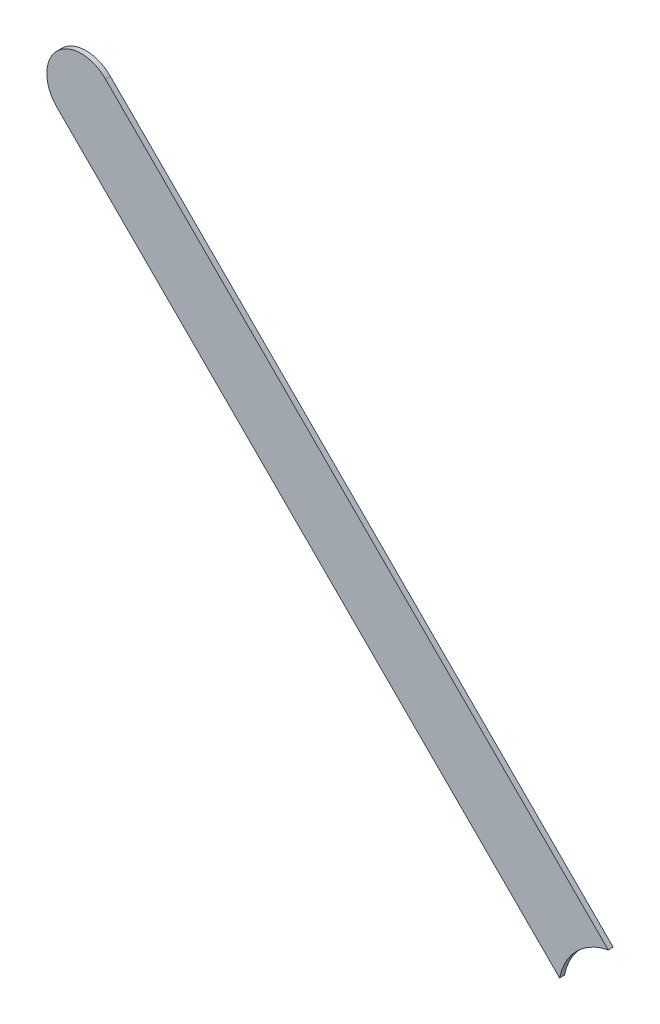
ISO-10303-21;
HEADER;
FILE_DESCRIPTION(('STEP AP214'),'2;1');
FILE_NAME('part.step','',(''),(''),'','','');
FILE_SCHEMA(('AUTOMOTIVE_DESIGN { 1 0 10303 214 1 1 1 1 }'));
ENDSEC;
DATA;
#1=APPLICATION_CONTEXT('core data for automotive mechanical design processes');
#2=APPLICATION_PROTOCOL_DEFINITION('international standard','automotive_design',2000,#1);
#3=PRODUCT_CONTEXT('',#1,'mechanical');
#4=PRODUCT('Part','Part','',(#3));
#5=PRODUCT_RELATED_PRODUCT_CATEGORY('part','',(#4));
#6=PRODUCT_DEFINITION_FORMATION('','',#4);
#7=PRODUCT_DEFINITION_CONTEXT('part definition',#1,'design');
#8=PRODUCT_DEFINITION('design','',#6,#7);
#9=PRODUCT_DEFINITION_SHAPE('','',#8);
#10=(LENGTH_UNIT() NAMED_UNIT(*) SI_UNIT(.MILLI.,.METRE.));
#11=(NAMED_UNIT(*) PLANE_ANGLE_UNIT() SI_UNIT($,.RADIAN.));
#12=(NAMED_UNIT(*) SI_UNIT($,.STERADIAN.) SOLID_ANGLE_UNIT());
#13=UNCERTAINTY_MEASURE_WITH_UNIT(LENGTH_MEASURE(1.E-05),#10,'distance_accuracy_value','');
#14=(GEOMETRIC_REPRESENTATION_CONTEXT(3) GLOBAL_UNCERTAINTY_ASSIGNED_CONTEXT((#13)) GLOBAL_UNIT_ASSIGNED_CONTEXT((#10,
#11,#12)) REPRESENTATION_CONTEXT('',''));
#15=CARTESIAN_POINT('',(0.,0.,0.));
#16=DIRECTION('',(0.,0.,1.));
#17=DIRECTION('',(1.,0.,0.));
#18=AXIS2_PLACEMENT_3D('',#15,#16,#17);
#19=CARTESIAN_POINT('',(113.10323582,63.82322262,0.));
#20=DIRECTION('',(0.707106781186546,0.707106781186549,0.));
#21=DIRECTION('',(0.707106781186549,-0.707106781186546,0.));
#22=AXIS2_PLACEMENT_3D('',#19,#20,#21);
#23=PLANE('',#22);
#24=DIRECTION('',(0.707106781186549,-0.707106781186546,0.));
#25=VECTOR('',#24,1.);
#26=CARTESIAN_POINT('',(113.10323582,63.82322262,0.03556));
#27=LINE('',#26,#25);
#28=CARTESIAN_POINT('',(113.10323582,63.82322262,0.03556));
#29=VERTEX_POINT('',#28);
#30=CARTESIAN_POINT('',(116.758668643605,60.1677897963948,0.03556));
#31=VERTEX_POINT('',#30);
#32=EDGE_CURVE('E11',#29,#31,#27,.T.);
#33=ORIENTED_EDGE('',*,*,#32,.F.);
#34=DIRECTION('',(0.,0.,1.));
#35=VECTOR('',#34,1.);
#36=CARTESIAN_POINT('',(113.10323582,63.82322262,0.));
#37=LINE('',#36,#35);
#38=CARTESIAN_POINT('',(113.10323582,63.82322262,0.));
#39=VERTEX_POINT('',#38);
#40=EDGE_CURVE('E24',#39,#29,#37,.T.);
#41=ORIENTED_EDGE('',*,*,#40,.F.);
#42=DIRECTION('',(0.707106781186549,-0.707106781186546,0.));
#43=VECTOR('',#42,1.);
#44=CARTESIAN_POINT('',(113.10323582,63.82322262,0.));
#45=LINE('',#44,#43);
#46=CARTESIAN_POINT('',(116.758668643605,60.1677897963948,0.));
#47=VERTEX_POINT('',#46);
#48=EDGE_CURVE('E75',#39,#47,#45,.T.);
#49=ORIENTED_EDGE('',*,*,#48,.T.);
#50=DIRECTION('',(0.,0.,1.));
#51=VECTOR('',#50,1.);
#52=CARTESIAN_POINT('',(116.758668643605,60.1677897963948,0.));
#53=LINE('',#52,#51);
#54=EDGE_CURVE('E37',#47,#31,#53,.T.);
#55=ORIENTED_EDGE('',*,*,#54,.T.);
#56=EDGE_LOOP('',(#33,#41,#49,#55));
#57=FACE_BOUND('',#56,.T.);
#58=ADVANCED_FACE('F17',(#57),#23,.F.);
#59=CARTESIAN_POINT('',(117.2000196,60.0799916,0.));
#60=DIRECTION('',(0.,0.,-1.));
#61=DIRECTION('',(1.,0.,0.));
#62=AXIS2_PLACEMENT_3D('',#59,#60,#61);
#63=CYLINDRICAL_SURFACE('',#62,0.4499991);
#64=DIRECTION('',(0.,0.,1.));
#65=VECTOR('',#64,1.);
#66=CARTESIAN_POINT('',(117.112221403605,60.5213425563948,0.));
#67=LINE('',#66,#65);
#68=CARTESIAN_POINT('',(117.112221403605,60.5213425563948,0.));
#69=VERTEX_POINT('',#68);
#70=CARTESIAN_POINT('',(117.112221403605,60.5213425563948,0.03556));
#71=VERTEX_POINT('',#70);
#72=EDGE_CURVE('E67',#69,#71,#67,.T.);
#73=ORIENTED_EDGE('',*,*,#72,.T.);
#74=CARTESIAN_POINT('',(117.2000196,60.0799916,0.03556));
#75=DIRECTION('',(0.,0.,1.));
#76=DIRECTION('',(1.,0.,0.));
#77=AXIS2_PLACEMENT_3D('',#74,#75,#76);
#78=CIRCLE('',#77,0.4499991);
#79=EDGE_CURVE('E82',#71,#31,#78,.T.);
#80=ORIENTED_EDGE('',*,*,#79,.T.);
#81=ORIENTED_EDGE('',*,*,#54,.F.);
#82=CARTESIAN_POINT('',(117.2000196,60.0799916,0.));
#83=DIRECTION('',(0.,0.,1.));
#84=DIRECTION('',(1.,0.,0.));
#85=AXIS2_PLACEMENT_3D('',#82,#83,#84);
#86=CIRCLE('',#85,0.4499991);
#87=EDGE_CURVE('E80',#69,#47,#86,.T.);
#88=ORIENTED_EDGE('',*,*,#87,.F.);
#89=EDGE_LOOP('',(#73,#80,#81,#88));
#90=FACE_BOUND('',#89,.T.);
#91=ADVANCED_FACE('F88',(#90),#63,.F.);
#92=CARTESIAN_POINT('',(117.112221403605,60.5213425563948,0.));
#93=DIRECTION('',(-0.70710678118655,-0.707106781186545,0.));
#94=DIRECTION('',(-0.707106781186545,0.70710678118655,0.));
#95=AXIS2_PLACEMENT_3D('',#92,#93,#94);
#96=PLANE('',#95);
#97=DIRECTION('',(-0.707106781186545,0.70710678118655,0.));
#98=VECTOR('',#97,1.);
#99=CARTESIAN_POINT('',(117.37679598,60.25676798,0.03556));
#100=LINE('',#99,#98);
#101=CARTESIAN_POINT('',(113.45678858,64.17677538,0.03556));
#102=VERTEX_POINT('',#101);
#103=EDGE_CURVE('E71',#71,#102,#100,.T.);
#104=ORIENTED_EDGE('',*,*,#103,.F.);
#105=ORIENTED_EDGE('',*,*,#72,.F.);
#106=DIRECTION('',(-0.707106781186545,0.70710678118655,0.));
#107=VECTOR('',#106,1.);
#108=CARTESIAN_POINT('',(117.37679598,60.25676798,0.));
#109=LINE('',#108,#107);
#110=CARTESIAN_POINT('',(113.45678858,64.17677538,0.));
#111=VERTEX_POINT('',#110);
#112=EDGE_CURVE('E63',#69,#111,#109,.T.);
#113=ORIENTED_EDGE('',*,*,#112,.T.);
#114=DIRECTION('',(0.,0.,1.));
#115=VECTOR('',#114,1.);
#116=CARTESIAN_POINT('',(113.45678858,64.17677538,0.));
#117=LINE('',#116,#115);
#118=EDGE_CURVE('E53',#111,#102,#117,.T.);
#119=ORIENTED_EDGE('',*,*,#118,.T.);
#120=EDGE_LOOP('',(#104,#105,#113,#119));
#121=FACE_BOUND('',#120,.T.);
#122=ADVANCED_FACE('F66',(#121),#96,.F.);
#123=CARTESIAN_POINT('',(113.2800122,63.999999,0.));
#124=DIRECTION('',(0.,0.,-1.));
#125=DIRECTION('',(0.707106781186548,0.707106781186548,0.));
#126=AXIS2_PLACEMENT_3D('',#123,#124,#125);
#127=CYLINDRICAL_SURFACE('',#126,0.249999554103228);
#128=CARTESIAN_POINT('',(113.2800122,63.999999,0.03556));
#129=DIRECTION('',(0.,0.,1.));
#130=DIRECTION('',(0.707106781186548,0.707106781186548,0.));
#131=AXIS2_PLACEMENT_3D('',#128,#129,#130);
#132=CIRCLE('',#131,0.249999554103228);
#133=EDGE_CURVE('E59',#102,#29,#132,.T.);
#134=ORIENTED_EDGE('',*,*,#133,.F.);
#135=ORIENTED_EDGE('',*,*,#118,.F.);
#136=CARTESIAN_POINT('',(113.2800122,63.999999,0.));
#137=DIRECTION('',(0.,0.,1.));
#138=DIRECTION('',(0.707106781186548,0.707106781186548,0.));
#139=AXIS2_PLACEMENT_3D('',#136,#137,#138);
#140=CIRCLE('',#139,0.249999554103228);
#141=EDGE_CURVE('E57',#111,#39,#140,.T.);
#142=ORIENTED_EDGE('',*,*,#141,.T.);
#143=ORIENTED_EDGE('',*,*,#40,.T.);
#144=EDGE_LOOP('',(#134,#135,#142,#143));
#145=FACE_BOUND('',#144,.T.);
#146=ADVANCED_FACE('F55',(#145),#127,.T.);
#147=CARTESIAN_POINT('',(113.10323582,63.82322262,0.));
#148=DIRECTION('',(0.,0.,-1.));
#149=DIRECTION('',(-1.,0.,0.));
#150=AXIS2_PLACEMENT_3D('',#147,#148,#149);
#151=PLANE('',#150);
#152=ORIENTED_EDGE('',*,*,#48,.F.);
#153=ORIENTED_EDGE('',*,*,#141,.F.);
#154=ORIENTED_EDGE('',*,*,#112,.F.);
#155=ORIENTED_EDGE('',*,*,#87,.T.);
#156=EDGE_LOOP('',(#152,#153,#154,#155));
#157=FACE_BOUND('',#156,.T.);
#158=ADVANCED_FACE('F74',(#157),#151,.T.);
#159=CARTESIAN_POINT('',(113.10323582,63.82322262,0.03556));
#160=DIRECTION('',(0.,0.,-1.));
#161=DIRECTION('',(-1.,0.,0.));
#162=AXIS2_PLACEMENT_3D('',#159,#160,#161);
#163=PLANE('',#162);
#164=ORIENTED_EDGE('',*,*,#133,.T.);
#165=ORIENTED_EDGE('',*,*,#32,.T.);
#166=ORIENTED_EDGE('',*,*,#79,.F.);
#167=ORIENTED_EDGE('',*,*,#103,.T.);
#168=EDGE_LOOP('',(#164,#165,#166,#167));
#169=FACE_BOUND('',#168,.T.);
#170=ADVANCED_FACE('F91',(#169),#163,.F.);
#171=CLOSED_SHELL('',(#58,#91,#122,#146,#158,#170));
#172=MANIFOLD_SOLID_BREP('B1',#171);
#173=ADVANCED_BREP_SHAPE_REPRESENTATION('',(#18,#172),#14);
#174=SHAPE_DEFINITION_REPRESENTATION(#9,#173);
ENDSEC;
END-ISO-10303-21;
